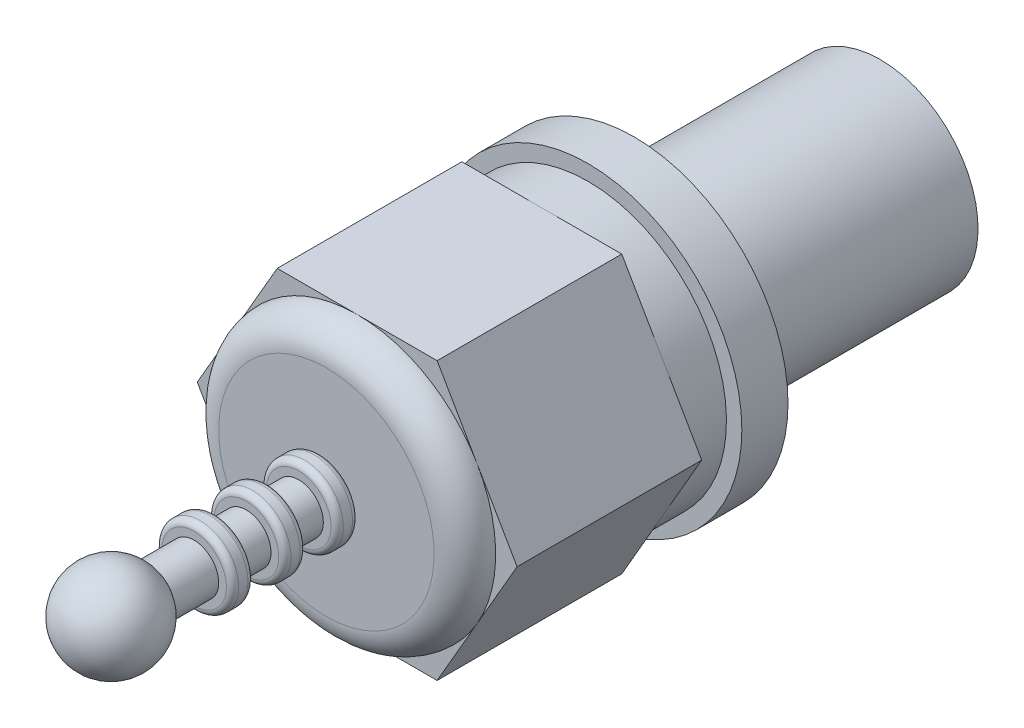
ISO-10303-21;
HEADER;
FILE_DESCRIPTION(('STEP AP214'),'2;1');
FILE_NAME('part.step','',(''),(''),'','','');
FILE_SCHEMA(('AUTOMOTIVE_DESIGN { 1 0 10303 214 1 1 1 1 }'));
ENDSEC;
DATA;
#1=APPLICATION_CONTEXT('core data for automotive mechanical design processes');
#2=APPLICATION_PROTOCOL_DEFINITION('international standard','automotive_design',2000,#1);
#3=PRODUCT_CONTEXT('',#1,'mechanical');
#4=PRODUCT('Part','Part','',(#3));
#5=PRODUCT_RELATED_PRODUCT_CATEGORY('part','',(#4));
#6=PRODUCT_DEFINITION_FORMATION('','',#4);
#7=PRODUCT_DEFINITION_CONTEXT('part definition',#1,'design');
#8=PRODUCT_DEFINITION('design','',#6,#7);
#9=PRODUCT_DEFINITION_SHAPE('','',#8);
#10=(LENGTH_UNIT() NAMED_UNIT(*) SI_UNIT(.MILLI.,.METRE.));
#11=(NAMED_UNIT(*) PLANE_ANGLE_UNIT() SI_UNIT($,.RADIAN.));
#12=(NAMED_UNIT(*) SI_UNIT($,.STERADIAN.) SOLID_ANGLE_UNIT());
#13=UNCERTAINTY_MEASURE_WITH_UNIT(LENGTH_MEASURE(1.E-05),#10,'distance_accuracy_value','');
#14=(GEOMETRIC_REPRESENTATION_CONTEXT(3) GLOBAL_UNCERTAINTY_ASSIGNED_CONTEXT((#13)) GLOBAL_UNIT_ASSIGNED_CONTEXT((#10,
#11,#12)) REPRESENTATION_CONTEXT('',''));
#15=CARTESIAN_POINT('',(0.,0.,0.));
#16=DIRECTION('',(0.,0.,1.));
#17=DIRECTION('',(1.,0.,0.));
#18=AXIS2_PLACEMENT_3D('',#15,#16,#17);
#19=CARTESIAN_POINT('',(0.,0.,0.));
#20=DIRECTION('',(0.,0.,-1.));
#21=DIRECTION('',(0.,1.,0.));
#22=AXIS2_PLACEMENT_3D('',#19,#20,#21);
#23=TOROIDAL_SURFACE('',#22,3.5,1.);
#24=CARTESIAN_POINT('',(0.,0.,1.));
#25=DIRECTION('',(0.,0.,-1.));
#26=DIRECTION('',(0.,1.,0.));
#27=AXIS2_PLACEMENT_3D('',#24,#25,#26);
#28=CIRCLE('',#27,3.5);
#29=CARTESIAN_POINT('',(0.,3.5,1.));
#30=VERTEX_POINT('',#29);
#31=EDGE_CURVE('E265',#30,#30,#28,.T.);
#32=ORIENTED_EDGE('',*,*,#31,.T.);
#33=EDGE_LOOP('',(#32));
#34=FACE_BOUND('',#33,.T.);
#35=CARTESIAN_POINT('',(0.,0.,0.));
#36=DIRECTION('',(0.,0.,-1.));
#37=DIRECTION('',(0.,1.,0.));
#38=AXIS2_PLACEMENT_3D('',#35,#36,#37);
#39=CIRCLE('',#38,4.5);
#40=CARTESIAN_POINT('',(0.,4.5,0.));
#41=VERTEX_POINT('',#40);
#42=CARTESIAN_POINT('',(3.89711431702998,2.25,0.));
#43=VERTEX_POINT('',#42);
#44=EDGE_CURVE('E268',#41,#43,#39,.T.);
#45=ORIENTED_EDGE('',*,*,#44,.F.);
#46=CARTESIAN_POINT('',(-3.89711431702998,2.25,0.));
#47=VERTEX_POINT('',#46);
#48=EDGE_CURVE('E58',#47,#41,#39,.T.);
#49=ORIENTED_EDGE('',*,*,#48,.F.);
#50=CARTESIAN_POINT('',(-3.89711431702998,-2.25000000000001,0.));
#51=VERTEX_POINT('',#50);
#52=EDGE_CURVE('E317',#51,#47,#39,.T.);
#53=ORIENTED_EDGE('',*,*,#52,.F.);
#54=CARTESIAN_POINT('',(0.,-4.50000000000001,0.));
#55=VERTEX_POINT('',#54);
#56=EDGE_CURVE('E319',#55,#51,#39,.T.);
#57=ORIENTED_EDGE('',*,*,#56,.F.);
#58=CARTESIAN_POINT('',(3.89711431702998,-2.25,0.));
#59=VERTEX_POINT('',#58);
#60=EDGE_CURVE('E320',#59,#55,#39,.T.);
#61=ORIENTED_EDGE('',*,*,#60,.F.);
#62=EDGE_CURVE('E272',#43,#59,#39,.T.);
#63=ORIENTED_EDGE('',*,*,#62,.F.);
#64=EDGE_LOOP('',(#45,#49,#53,#57,#61,#63));
#65=FACE_BOUND('',#64,.T.);
#66=ADVANCED_FACE('F34',(#34,#65),#23,.T.);
#67=CARTESIAN_POINT('',(0.,3.5,1.));
#68=DIRECTION('',(0.,0.,1.));
#69=DIRECTION('',(0.,-1.,0.));
#70=AXIS2_PLACEMENT_3D('',#67,#68,#69);
#71=PLANE('',#70);
#72=CARTESIAN_POINT('',(0.,0.,1.));
#73=DIRECTION('',(0.,0.,-1.));
#74=DIRECTION('',(0.,1.,0.));
#75=AXIS2_PLACEMENT_3D('',#72,#73,#74);
#76=CIRCLE('',#75,0.800000000000002);
#77=CARTESIAN_POINT('',(0.,0.799999999999997,1.));
#78=VERTEX_POINT('',#77);
#79=EDGE_CURVE('E262',#78,#78,#76,.T.);
#80=ORIENTED_EDGE('',*,*,#79,.T.);
#81=EDGE_LOOP('',(#80));
#82=FACE_BOUND('',#81,.T.);
#83=ORIENTED_EDGE('',*,*,#31,.F.);
#84=EDGE_LOOP('',(#83));
#85=FACE_BOUND('',#84,.T.);
#86=ADVANCED_FACE('F349',(#82,#85),#71,.T.);
#87=CARTESIAN_POINT('',(0.,0.,-17.));
#88=DIRECTION('',(0.,0.,-1.));
#89=DIRECTION('',(0.,1.,0.));
#90=AXIS2_PLACEMENT_3D('',#87,#88,#89);
#91=CYLINDRICAL_SURFACE('',#90,0.800000000000003);
#92=CARTESIAN_POINT('',(0.,0.,1.2));
#93=DIRECTION('',(0.,0.,-1.));
#94=DIRECTION('',(0.,1.,0.));
#95=AXIS2_PLACEMENT_3D('',#92,#93,#94);
#96=CIRCLE('',#95,0.800000000000004);
#97=CARTESIAN_POINT('',(0.,0.8,1.2));
#98=VERTEX_POINT('',#97);
#99=EDGE_CURVE('E259',#98,#98,#96,.T.);
#100=ORIENTED_EDGE('',*,*,#99,.T.);
#101=EDGE_LOOP('',(#100));
#102=FACE_BOUND('',#101,.T.);
#103=ORIENTED_EDGE('',*,*,#79,.F.);
#104=EDGE_LOOP('',(#103));
#105=FACE_BOUND('',#104,.T.);
#106=ADVANCED_FACE('F355',(#102,#105),#91,.T.);
#107=CARTESIAN_POINT('',(0.,0.8,1.2));
#108=DIRECTION('',(0.,0.,-1.));
#109=DIRECTION('',(0.,1.,0.));
#110=AXIS2_PLACEMENT_3D('',#107,#108,#109);
#111=PLANE('',#110);
#112=CARTESIAN_POINT('',(0.,0.,1.2));
#113=DIRECTION('',(0.,0.,-1.));
#114=DIRECTION('',(0.,1.,0.));
#115=AXIS2_PLACEMENT_3D('',#112,#113,#114);
#116=CIRCLE('',#115,1.05000000000001);
#117=CARTESIAN_POINT('',(0.,1.05,1.2));
#118=VERTEX_POINT('',#117);
#119=EDGE_CURVE('E256',#118,#118,#116,.T.);
#120=ORIENTED_EDGE('',*,*,#119,.T.);
#121=EDGE_LOOP('',(#120));
#122=FACE_BOUND('',#121,.T.);
#123=ORIENTED_EDGE('',*,*,#99,.F.);
#124=EDGE_LOOP('',(#123));
#125=FACE_BOUND('',#124,.T.);
#126=ADVANCED_FACE('F615',(#122,#125),#111,.T.);
#127=CARTESIAN_POINT('',(0.,0.,1.4));
#128=DIRECTION('',(0.,0.,-1.));
#129=DIRECTION('',(0.,1.,0.));
#130=AXIS2_PLACEMENT_3D('',#127,#128,#129);
#131=TOROIDAL_SURFACE('',#130,1.05000000000001,0.2);
#132=CARTESIAN_POINT('',(0.,0.,1.4));
#133=DIRECTION('',(0.,0.,-1.));
#134=DIRECTION('',(0.,1.,0.));
#135=AXIS2_PLACEMENT_3D('',#132,#133,#134);
#136=CIRCLE('',#135,1.25000000000001);
#137=CARTESIAN_POINT('',(0.,1.25,1.4));
#138=VERTEX_POINT('',#137);
#139=EDGE_CURVE('E253',#138,#138,#136,.T.);
#140=ORIENTED_EDGE('',*,*,#139,.T.);
#141=EDGE_LOOP('',(#140));
#142=FACE_BOUND('',#141,.T.);
#143=ORIENTED_EDGE('',*,*,#119,.F.);
#144=EDGE_LOOP('',(#143));
#145=FACE_BOUND('',#144,.T.);
#146=ADVANCED_FACE('F607',(#142,#145),#131,.T.);
#147=CARTESIAN_POINT('',(0.,0.,-17.));
#148=DIRECTION('',(0.,0.,-1.));
#149=DIRECTION('',(0.,1.,0.));
#150=AXIS2_PLACEMENT_3D('',#147,#148,#149);
#151=CYLINDRICAL_SURFACE('',#150,1.25000000000001);
#152=CARTESIAN_POINT('',(0.,0.,1.7));
#153=DIRECTION('',(0.,0.,-1.));
#154=DIRECTION('',(0.,1.,0.));
#155=AXIS2_PLACEMENT_3D('',#152,#153,#154);
#156=CIRCLE('',#155,1.25000000000001);
#157=CARTESIAN_POINT('',(0.,1.25,1.7));
#158=VERTEX_POINT('',#157);
#159=EDGE_CURVE('E250',#158,#158,#156,.T.);
#160=ORIENTED_EDGE('',*,*,#159,.T.);
#161=EDGE_LOOP('',(#160));
#162=FACE_BOUND('',#161,.T.);
#163=ORIENTED_EDGE('',*,*,#139,.F.);
#164=EDGE_LOOP('',(#163));
#165=FACE_BOUND('',#164,.T.);
#166=ADVANCED_FACE('F599',(#162,#165),#151,.T.);
#167=CARTESIAN_POINT('',(0.,0.,1.7));
#168=DIRECTION('',(0.,0.,-1.));
#169=DIRECTION('',(0.,1.,0.));
#170=AXIS2_PLACEMENT_3D('',#167,#168,#169);
#171=TOROIDAL_SURFACE('',#170,1.05000000000001,0.2);
#172=CARTESIAN_POINT('',(0.,0.,1.9));
#173=DIRECTION('',(0.,0.,-1.));
#174=DIRECTION('',(0.,1.,0.));
#175=AXIS2_PLACEMENT_3D('',#172,#173,#174);
#176=CIRCLE('',#175,1.05000000000001);
#177=CARTESIAN_POINT('',(0.,1.05,1.9));
#178=VERTEX_POINT('',#177);
#179=EDGE_CURVE('E247',#178,#178,#176,.T.);
#180=ORIENTED_EDGE('',*,*,#179,.T.);
#181=EDGE_LOOP('',(#180));
#182=FACE_BOUND('',#181,.T.);
#183=ORIENTED_EDGE('',*,*,#159,.F.);
#184=EDGE_LOOP('',(#183));
#185=FACE_BOUND('',#184,.T.);
#186=ADVANCED_FACE('F592',(#182,#185),#171,.T.);
#187=CARTESIAN_POINT('',(0.,0.799999999999999,1.9));
#188=DIRECTION('',(0.,0.,1.));
#189=DIRECTION('',(0.,-1.,0.));
#190=AXIS2_PLACEMENT_3D('',#187,#188,#189);
#191=PLANE('',#190);
#192=CARTESIAN_POINT('',(0.,0.,1.9));
#193=DIRECTION('',(0.,0.,-1.));
#194=DIRECTION('',(0.,1.,0.));
#195=AXIS2_PLACEMENT_3D('',#192,#193,#194);
#196=CIRCLE('',#195,0.800000000000004);
#197=CARTESIAN_POINT('',(0.,0.799999999999999,1.9));
#198=VERTEX_POINT('',#197);
#199=EDGE_CURVE('E244',#198,#198,#196,.T.);
#200=ORIENTED_EDGE('',*,*,#199,.T.);
#201=EDGE_LOOP('',(#200));
#202=FACE_BOUND('',#201,.T.);
#203=ORIENTED_EDGE('',*,*,#179,.F.);
#204=EDGE_LOOP('',(#203));
#205=FACE_BOUND('',#204,.T.);
#206=ADVANCED_FACE('F584',(#202,#205),#191,.T.);
#207=CARTESIAN_POINT('',(0.,0.,-17.));
#208=DIRECTION('',(0.,0.,-1.));
#209=DIRECTION('',(0.,1.,0.));
#210=AXIS2_PLACEMENT_3D('',#207,#208,#209);
#211=CYLINDRICAL_SURFACE('',#210,0.800000000000004);
#212=CARTESIAN_POINT('',(0.,0.,2.9));
#213=DIRECTION('',(0.,0.,-1.));
#214=DIRECTION('',(0.,1.,0.));
#215=AXIS2_PLACEMENT_3D('',#212,#213,#214);
#216=CIRCLE('',#215,0.800000000000004);
#217=CARTESIAN_POINT('',(0.,0.8,2.9));
#218=VERTEX_POINT('',#217);
#219=EDGE_CURVE('E241',#218,#218,#216,.T.);
#220=ORIENTED_EDGE('',*,*,#219,.T.);
#221=EDGE_LOOP('',(#220));
#222=FACE_BOUND('',#221,.T.);
#223=ORIENTED_EDGE('',*,*,#199,.F.);
#224=EDGE_LOOP('',(#223));
#225=FACE_BOUND('',#224,.T.);
#226=ADVANCED_FACE('F577',(#222,#225),#211,.T.);
#227=CARTESIAN_POINT('',(0.,0.8,2.9));
#228=DIRECTION('',(0.,0.,-1.));
#229=DIRECTION('',(0.,1.,0.));
#230=AXIS2_PLACEMENT_3D('',#227,#228,#229);
#231=PLANE('',#230);
#232=CARTESIAN_POINT('',(0.,0.,2.9));
#233=DIRECTION('',(0.,0.,-1.));
#234=DIRECTION('',(0.,1.,0.));
#235=AXIS2_PLACEMENT_3D('',#232,#233,#234);
#236=CIRCLE('',#235,1.05000000000001);
#237=CARTESIAN_POINT('',(0.,1.05,2.9));
#238=VERTEX_POINT('',#237);
#239=EDGE_CURVE('E238',#238,#238,#236,.T.);
#240=ORIENTED_EDGE('',*,*,#239,.T.);
#241=EDGE_LOOP('',(#240));
#242=FACE_BOUND('',#241,.T.);
#243=ORIENTED_EDGE('',*,*,#219,.F.);
#244=EDGE_LOOP('',(#243));
#245=FACE_BOUND('',#244,.T.);
#246=ADVANCED_FACE('F568',(#242,#245),#231,.T.);
#247=CARTESIAN_POINT('',(0.,0.,3.1));
#248=DIRECTION('',(0.,0.,-1.));
#249=DIRECTION('',(0.,1.,0.));
#250=AXIS2_PLACEMENT_3D('',#247,#248,#249);
#251=TOROIDAL_SURFACE('',#250,1.05000000000001,0.2);
#252=CARTESIAN_POINT('',(0.,0.,3.1));
#253=DIRECTION('',(0.,0.,-1.));
#254=DIRECTION('',(0.,1.,0.));
#255=AXIS2_PLACEMENT_3D('',#252,#253,#254);
#256=CIRCLE('',#255,1.25000000000001);
#257=CARTESIAN_POINT('',(0.,1.25,3.1));
#258=VERTEX_POINT('',#257);
#259=EDGE_CURVE('E235',#258,#258,#256,.T.);
#260=ORIENTED_EDGE('',*,*,#259,.T.);
#261=EDGE_LOOP('',(#260));
#262=FACE_BOUND('',#261,.T.);
#263=ORIENTED_EDGE('',*,*,#239,.F.);
#264=EDGE_LOOP('',(#263));
#265=FACE_BOUND('',#264,.T.);
#266=ADVANCED_FACE('F560',(#262,#265),#251,.T.);
#267=CARTESIAN_POINT('',(0.,0.,-17.));
#268=DIRECTION('',(0.,0.,-1.));
#269=DIRECTION('',(0.,1.,0.));
#270=AXIS2_PLACEMENT_3D('',#267,#268,#269);
#271=CYLINDRICAL_SURFACE('',#270,1.25000000000001);
#272=CARTESIAN_POINT('',(0.,0.,3.4));
#273=DIRECTION('',(0.,0.,-1.));
#274=DIRECTION('',(0.,1.,0.));
#275=AXIS2_PLACEMENT_3D('',#272,#273,#274);
#276=CIRCLE('',#275,1.25000000000001);
#277=CARTESIAN_POINT('',(0.,1.25,3.4));
#278=VERTEX_POINT('',#277);
#279=EDGE_CURVE('E232',#278,#278,#276,.T.);
#280=ORIENTED_EDGE('',*,*,#279,.T.);
#281=EDGE_LOOP('',(#280));
#282=FACE_BOUND('',#281,.T.);
#283=ORIENTED_EDGE('',*,*,#259,.F.);
#284=EDGE_LOOP('',(#283));
#285=FACE_BOUND('',#284,.T.);
#286=ADVANCED_FACE('F552',(#282,#285),#271,.T.);
#287=CARTESIAN_POINT('',(0.,0.,3.4));
#288=DIRECTION('',(0.,0.,-1.));
#289=DIRECTION('',(0.,1.,0.));
#290=AXIS2_PLACEMENT_3D('',#287,#288,#289);
#291=TOROIDAL_SURFACE('',#290,1.05000000000001,0.2);
#292=CARTESIAN_POINT('',(0.,0.,3.6));
#293=DIRECTION('',(0.,0.,-1.));
#294=DIRECTION('',(0.,1.,0.));
#295=AXIS2_PLACEMENT_3D('',#292,#293,#294);
#296=CIRCLE('',#295,1.05000000000001);
#297=CARTESIAN_POINT('',(0.,1.05,3.6));
#298=VERTEX_POINT('',#297);
#299=EDGE_CURVE('E229',#298,#298,#296,.T.);
#300=ORIENTED_EDGE('',*,*,#299,.T.);
#301=EDGE_LOOP('',(#300));
#302=FACE_BOUND('',#301,.T.);
#303=ORIENTED_EDGE('',*,*,#279,.F.);
#304=EDGE_LOOP('',(#303));
#305=FACE_BOUND('',#304,.T.);
#306=ADVANCED_FACE('F544',(#302,#305),#291,.T.);
#307=CARTESIAN_POINT('',(0.,0.799999999999999,3.6));
#308=DIRECTION('',(0.,0.,1.));
#309=DIRECTION('',(0.,-1.,0.));
#310=AXIS2_PLACEMENT_3D('',#307,#308,#309);
#311=PLANE('',#310);
#312=CARTESIAN_POINT('',(0.,0.,3.6));
#313=DIRECTION('',(0.,0.,-1.));
#314=DIRECTION('',(0.,1.,0.));
#315=AXIS2_PLACEMENT_3D('',#312,#313,#314);
#316=CIRCLE('',#315,0.800000000000004);
#317=CARTESIAN_POINT('',(0.,0.799999999999999,3.6));
#318=VERTEX_POINT('',#317);
#319=EDGE_CURVE('E226',#318,#318,#316,.T.);
#320=ORIENTED_EDGE('',*,*,#319,.T.);
#321=EDGE_LOOP('',(#320));
#322=FACE_BOUND('',#321,.T.);
#323=ORIENTED_EDGE('',*,*,#299,.F.);
#324=EDGE_LOOP('',(#323));
#325=FACE_BOUND('',#324,.T.);
#326=ADVANCED_FACE('F536',(#322,#325),#311,.T.);
#327=CARTESIAN_POINT('',(0.,0.,-17.));
#328=DIRECTION('',(0.,0.,-1.));
#329=DIRECTION('',(0.,1.,0.));
#330=AXIS2_PLACEMENT_3D('',#327,#328,#329);
#331=CYLINDRICAL_SURFACE('',#330,0.800000000000004);
#332=CARTESIAN_POINT('',(0.,0.,4.6));
#333=DIRECTION('',(0.,0.,-1.));
#334=DIRECTION('',(0.,1.,0.));
#335=AXIS2_PLACEMENT_3D('',#332,#333,#334);
#336=CIRCLE('',#335,0.800000000000004);
#337=CARTESIAN_POINT('',(0.,0.799999999999999,4.6));
#338=VERTEX_POINT('',#337);
#339=EDGE_CURVE('E223',#338,#338,#336,.T.);
#340=ORIENTED_EDGE('',*,*,#339,.T.);
#341=EDGE_LOOP('',(#340));
#342=FACE_BOUND('',#341,.T.);
#343=ORIENTED_EDGE('',*,*,#319,.F.);
#344=EDGE_LOOP('',(#343));
#345=FACE_BOUND('',#344,.T.);
#346=ADVANCED_FACE('F528',(#342,#345),#331,.T.);
#347=CARTESIAN_POINT('',(0.,0.799999999999999,4.6));
#348=DIRECTION('',(0.,0.,-1.));
#349=DIRECTION('',(0.,1.,0.));
#350=AXIS2_PLACEMENT_3D('',#347,#348,#349);
#351=PLANE('',#350);
#352=CARTESIAN_POINT('',(0.,0.,4.6));
#353=DIRECTION('',(0.,0.,-1.));
#354=DIRECTION('',(0.,1.,0.));
#355=AXIS2_PLACEMENT_3D('',#352,#353,#354);
#356=CIRCLE('',#355,1.05000000000001);
#357=CARTESIAN_POINT('',(0.,1.05,4.6));
#358=VERTEX_POINT('',#357);
#359=EDGE_CURVE('E220',#358,#358,#356,.T.);
#360=ORIENTED_EDGE('',*,*,#359,.T.);
#361=EDGE_LOOP('',(#360));
#362=FACE_BOUND('',#361,.T.);
#363=ORIENTED_EDGE('',*,*,#339,.F.);
#364=EDGE_LOOP('',(#363));
#365=FACE_BOUND('',#364,.T.);
#366=ADVANCED_FACE('F520',(#362,#365),#351,.T.);
#367=CARTESIAN_POINT('',(0.,0.,4.8));
#368=DIRECTION('',(0.,0.,-1.));
#369=DIRECTION('',(0.,1.,0.));
#370=AXIS2_PLACEMENT_3D('',#367,#368,#369);
#371=TOROIDAL_SURFACE('',#370,1.05000000000001,0.2);
#372=CARTESIAN_POINT('',(0.,0.,4.8));
#373=DIRECTION('',(0.,0.,-1.));
#374=DIRECTION('',(0.,1.,0.));
#375=AXIS2_PLACEMENT_3D('',#372,#373,#374);
#376=CIRCLE('',#375,1.25000000000001);
#377=CARTESIAN_POINT('',(0.,1.25,4.8));
#378=VERTEX_POINT('',#377);
#379=EDGE_CURVE('E217',#378,#378,#376,.T.);
#380=ORIENTED_EDGE('',*,*,#379,.T.);
#381=EDGE_LOOP('',(#380));
#382=FACE_BOUND('',#381,.T.);
#383=ORIENTED_EDGE('',*,*,#359,.F.);
#384=EDGE_LOOP('',(#383));
#385=FACE_BOUND('',#384,.T.);
#386=ADVANCED_FACE('F512',(#382,#385),#371,.T.);
#387=CARTESIAN_POINT('',(0.,0.,-17.));
#388=DIRECTION('',(0.,0.,-1.));
#389=DIRECTION('',(0.,1.,0.));
#390=AXIS2_PLACEMENT_3D('',#387,#388,#389);
#391=CYLINDRICAL_SURFACE('',#390,1.25000000000001);
#392=CARTESIAN_POINT('',(0.,0.,5.1));
#393=DIRECTION('',(0.,0.,-1.));
#394=DIRECTION('',(0.,1.,0.));
#395=AXIS2_PLACEMENT_3D('',#392,#393,#394);
#396=CIRCLE('',#395,1.25000000000001);
#397=CARTESIAN_POINT('',(0.,1.25,5.1));
#398=VERTEX_POINT('',#397);
#399=EDGE_CURVE('E214',#398,#398,#396,.T.);
#400=ORIENTED_EDGE('',*,*,#399,.T.);
#401=EDGE_LOOP('',(#400));
#402=FACE_BOUND('',#401,.T.);
#403=ORIENTED_EDGE('',*,*,#379,.F.);
#404=EDGE_LOOP('',(#403));
#405=FACE_BOUND('',#404,.T.);
#406=ADVANCED_FACE('F504',(#402,#405),#391,.T.);
#407=CARTESIAN_POINT('',(0.,0.,5.1));
#408=DIRECTION('',(0.,0.,-1.));
#409=DIRECTION('',(0.,1.,0.));
#410=AXIS2_PLACEMENT_3D('',#407,#408,#409);
#411=TOROIDAL_SURFACE('',#410,1.05000000000001,0.200000000000001);
#412=CARTESIAN_POINT('',(0.,0.,5.3));
#413=DIRECTION('',(0.,0.,-1.));
#414=DIRECTION('',(0.,1.,0.));
#415=AXIS2_PLACEMENT_3D('',#412,#413,#414);
#416=CIRCLE('',#415,1.05000000000001);
#417=CARTESIAN_POINT('',(0.,1.05,5.3));
#418=VERTEX_POINT('',#417);
#419=EDGE_CURVE('E211',#418,#418,#416,.T.);
#420=ORIENTED_EDGE('',*,*,#419,.T.);
#421=EDGE_LOOP('',(#420));
#422=FACE_BOUND('',#421,.T.);
#423=ORIENTED_EDGE('',*,*,#399,.F.);
#424=EDGE_LOOP('',(#423));
#425=FACE_BOUND('',#424,.T.);
#426=ADVANCED_FACE('F494',(#422,#425),#411,.T.);
#427=CARTESIAN_POINT('',(0.,0.8,5.3));
#428=DIRECTION('',(0.,0.,1.));
#429=DIRECTION('',(0.,-1.,0.));
#430=AXIS2_PLACEMENT_3D('',#427,#428,#429);
#431=PLANE('',#430);
#432=CARTESIAN_POINT('',(0.,0.,5.3));
#433=DIRECTION('',(0.,0.,-1.));
#434=DIRECTION('',(0.,1.,0.));
#435=AXIS2_PLACEMENT_3D('',#432,#433,#434);
#436=CIRCLE('',#435,0.800000000000004);
#437=CARTESIAN_POINT('',(0.,0.799999999999999,5.3));
#438=VERTEX_POINT('',#437);
#439=EDGE_CURVE('E208',#438,#438,#436,.T.);
#440=ORIENTED_EDGE('',*,*,#439,.T.);
#441=EDGE_LOOP('',(#440));
#442=FACE_BOUND('',#441,.T.);
#443=ORIENTED_EDGE('',*,*,#419,.F.);
#444=EDGE_LOOP('',(#443));
#445=FACE_BOUND('',#444,.T.);
#446=ADVANCED_FACE('F485',(#442,#445),#431,.T.);
#447=CARTESIAN_POINT('',(0.,0.,-17.));
#448=DIRECTION('',(0.,0.,-1.));
#449=DIRECTION('',(0.,1.,0.));
#450=AXIS2_PLACEMENT_3D('',#447,#448,#449);
#451=CYLINDRICAL_SURFACE('',#450,0.800000000000002);
#452=CARTESIAN_POINT('',(0.,0.,6.73114224595505));
#453=DIRECTION('',(0.,0.,-1.));
#454=DIRECTION('',(0.,1.,0.));
#455=AXIS2_PLACEMENT_3D('',#452,#453,#454);
#456=CIRCLE('',#455,0.800000000000001);
#457=CARTESIAN_POINT('',(0.,0.799999999999996,6.73114224595505));
#458=VERTEX_POINT('',#457);
#459=EDGE_CURVE('E194',#458,#458,#456,.T.);
#460=ORIENTED_EDGE('',*,*,#459,.T.);
#461=EDGE_LOOP('',(#460));
#462=FACE_BOUND('',#461,.T.);
#463=ORIENTED_EDGE('',*,*,#439,.F.);
#464=EDGE_LOOP('',(#463));
#465=FACE_BOUND('',#464,.T.);
#466=ADVANCED_FACE('F476',(#462,#465),#451,.T.);
#467=CARTESIAN_POINT('',(0.,0.,8.));
#468=DIRECTION('',(0.,0.,-1.));
#469=DIRECTION('',(0.,1.,0.));
#470=AXIS2_PLACEMENT_3D('',#467,#468,#469);
#471=SPHERICAL_SURFACE('',#470,1.5);
#472=ORIENTED_EDGE('',*,*,#459,.F.);
#473=EDGE_LOOP('',(#472));
#474=FACE_BOUND('',#473,.T.);
#475=ADVANCED_FACE('F469',(#474),#471,.T.);
#476=CARTESIAN_POINT('',(2.59807621135332,4.5,-6.));
#477=DIRECTION('',(0.,1.,0.));
#478=DIRECTION('',(-1.,0.,0.));
#479=AXIS2_PLACEMENT_3D('',#476,#477,#478);
#480=PLANE('',#479);
#481=DIRECTION('',(-1.,0.,0.));
#482=VECTOR('',#481,1.);
#483=CARTESIAN_POINT('',(2.59807621135332,4.5,0.));
#484=LINE('',#483,#482);
#485=CARTESIAN_POINT('',(-2.59807621135332,4.5,0.));
#486=VERTEX_POINT('',#485);
#487=EDGE_CURVE('E174',#41,#486,#484,.T.);
#488=ORIENTED_EDGE('',*,*,#487,.F.);
#489=CARTESIAN_POINT('',(2.59807621135332,4.5,0.));
#490=VERTEX_POINT('',#489);
#491=EDGE_CURVE('E170',#490,#41,#484,.T.);
#492=ORIENTED_EDGE('',*,*,#491,.F.);
#493=DIRECTION('',(0.,0.,1.));
#494=VECTOR('',#493,1.);
#495=CARTESIAN_POINT('',(2.59807621135332,4.5,-6.));
#496=LINE('',#495,#494);
#497=CARTESIAN_POINT('',(2.59807621135332,4.5,-6.));
#498=VERTEX_POINT('',#497);
#499=EDGE_CURVE('E191',#498,#490,#496,.T.);
#500=ORIENTED_EDGE('',*,*,#499,.F.);
#501=DIRECTION('',(-1.,0.,0.));
#502=VECTOR('',#501,1.);
#503=CARTESIAN_POINT('',(2.59807621135332,4.5,-6.));
#504=LINE('',#503,#502);
#505=CARTESIAN_POINT('',(0.,4.5,-6.));
#506=VERTEX_POINT('',#505);
#507=EDGE_CURVE('E134',#498,#506,#504,.T.);
#508=ORIENTED_EDGE('',*,*,#507,.T.);
#509=CARTESIAN_POINT('',(-2.59807621135332,4.5,-6.));
#510=VERTEX_POINT('',#509);
#511=EDGE_CURVE('E126',#506,#510,#504,.T.);
#512=ORIENTED_EDGE('',*,*,#511,.T.);
#513=DIRECTION('',(0.,0.,1.));
#514=VECTOR('',#513,1.);
#515=CARTESIAN_POINT('',(-2.59807621135332,4.5,-6.));
#516=LINE('',#515,#514);
#517=EDGE_CURVE('E130',#510,#486,#516,.T.);
#518=ORIENTED_EDGE('',*,*,#517,.T.);
#519=EDGE_LOOP('',(#488,#492,#500,#508,#512,#518));
#520=FACE_BOUND('',#519,.T.);
#521=ADVANCED_FACE('F129',(#520),#480,.T.);
#522=CARTESIAN_POINT('',(5.19615242270664,0.,-6.));
#523=DIRECTION('',(0.866025403784438,0.5,0.));
#524=DIRECTION('',(-0.5,0.866025403784439,0.));
#525=AXIS2_PLACEMENT_3D('',#522,#523,#524);
#526=PLANE('',#525);
#527=DIRECTION('',(-0.5,0.866025403784439,0.));
#528=VECTOR('',#527,1.);
#529=CARTESIAN_POINT('',(5.19615242270664,0.,0.));
#530=LINE('',#529,#528);
#531=EDGE_CURVE('E188',#43,#490,#530,.T.);
#532=ORIENTED_EDGE('',*,*,#531,.F.);
#533=CARTESIAN_POINT('',(5.19615242270664,0.,0.));
#534=VERTEX_POINT('',#533);
#535=EDGE_CURVE('E138',#534,#43,#530,.T.);
#536=ORIENTED_EDGE('',*,*,#535,.F.);
#537=DIRECTION('',(0.,0.,1.));
#538=VECTOR('',#537,1.);
#539=CARTESIAN_POINT('',(5.19615242270664,0.,-6.));
#540=LINE('',#539,#538);
#541=CARTESIAN_POINT('',(5.19615242270664,0.,-6.));
#542=VERTEX_POINT('',#541);
#543=EDGE_CURVE('E195',#542,#534,#540,.T.);
#544=ORIENTED_EDGE('',*,*,#543,.F.);
#545=DIRECTION('',(-0.5,0.866025403784439,0.));
#546=VECTOR('',#545,1.);
#547=CARTESIAN_POINT('',(5.19615242270664,0.,-6.));
#548=LINE('',#547,#546);
#549=CARTESIAN_POINT('',(3.89711431702998,2.25,-6.));
#550=VERTEX_POINT('',#549);
#551=EDGE_CURVE('E149',#542,#550,#548,.T.);
#552=ORIENTED_EDGE('',*,*,#551,.T.);
#553=EDGE_CURVE('E167',#550,#498,#548,.T.);
#554=ORIENTED_EDGE('',*,*,#553,.T.);
#555=ORIENTED_EDGE('',*,*,#499,.T.);
#556=EDGE_LOOP('',(#532,#536,#544,#552,#554,#555));
#557=FACE_BOUND('',#556,.T.);
#558=ADVANCED_FACE('F329',(#557),#526,.T.);
#559=CARTESIAN_POINT('',(2.59807621135332,-4.5,-6.));
#560=DIRECTION('',(0.866025403784439,-0.5,0.));
#561=DIRECTION('',(0.5,0.866025403784439,0.));
#562=AXIS2_PLACEMENT_3D('',#559,#560,#561);
#563=PLANE('',#562);
#564=DIRECTION('',(0.5,0.866025403784439,0.));
#565=VECTOR('',#564,1.);
#566=CARTESIAN_POINT('',(2.59807621135332,-4.5,0.));
#567=LINE('',#566,#565);
#568=EDGE_CURVE('E184',#59,#534,#567,.T.);
#569=ORIENTED_EDGE('',*,*,#568,.F.);
#570=CARTESIAN_POINT('',(2.59807621135332,-4.5,0.));
#571=VERTEX_POINT('',#570);
#572=EDGE_CURVE('E185',#571,#59,#567,.T.);
#573=ORIENTED_EDGE('',*,*,#572,.F.);
#574=DIRECTION('',(0.,0.,1.));
#575=VECTOR('',#574,1.);
#576=CARTESIAN_POINT('',(2.59807621135332,-4.5,-6.));
#577=LINE('',#576,#575);
#578=CARTESIAN_POINT('',(2.59807621135332,-4.5,-6.));
#579=VERTEX_POINT('',#578);
#580=EDGE_CURVE('E198',#579,#571,#577,.T.);
#581=ORIENTED_EDGE('',*,*,#580,.F.);
#582=DIRECTION('',(0.5,0.866025403784439,0.));
#583=VECTOR('',#582,1.);
#584=CARTESIAN_POINT('',(2.59807621135332,-4.5,-6.));
#585=LINE('',#584,#583);
#586=CARTESIAN_POINT('',(3.89711431702998,-2.25,-6.));
#587=VERTEX_POINT('',#586);
#588=EDGE_CURVE('E50',#579,#587,#585,.T.);
#589=ORIENTED_EDGE('',*,*,#588,.T.);
#590=EDGE_CURVE('E165',#587,#542,#585,.T.);
#591=ORIENTED_EDGE('',*,*,#590,.T.);
#592=ORIENTED_EDGE('',*,*,#543,.T.);
#593=EDGE_LOOP('',(#569,#573,#581,#589,#591,#592));
#594=FACE_BOUND('',#593,.T.);
#595=ADVANCED_FACE('F338',(#594),#563,.T.);
#596=CARTESIAN_POINT('',(-2.59807621135331,-4.5,-6.));
#597=DIRECTION('',(0.,-1.,0.));
#598=DIRECTION('',(1.,0.,0.));
#599=AXIS2_PLACEMENT_3D('',#596,#597,#598);
#600=PLANE('',#599);
#601=DIRECTION('',(1.,0.,0.));
#602=VECTOR('',#601,1.);
#603=CARTESIAN_POINT('',(-2.59807621135331,-4.5,0.));
#604=LINE('',#603,#602);
#605=EDGE_CURVE('E180',#55,#571,#604,.T.);
#606=ORIENTED_EDGE('',*,*,#605,.F.);
#607=CARTESIAN_POINT('',(-2.59807621135331,-4.5,0.));
#608=VERTEX_POINT('',#607);
#609=EDGE_CURVE('E181',#608,#55,#604,.T.);
#610=ORIENTED_EDGE('',*,*,#609,.F.);
#611=DIRECTION('',(0.,0.,1.));
#612=VECTOR('',#611,1.);
#613=CARTESIAN_POINT('',(-2.59807621135331,-4.5,-6.));
#614=LINE('',#613,#612);
#615=CARTESIAN_POINT('',(-2.59807621135331,-4.5,-6.));
#616=VERTEX_POINT('',#615);
#617=EDGE_CURVE('E201',#616,#608,#614,.T.);
#618=ORIENTED_EDGE('',*,*,#617,.F.);
#619=DIRECTION('',(1.,0.,0.));
#620=VECTOR('',#619,1.);
#621=CARTESIAN_POINT('',(-2.59807621135331,-4.5,-6.));
#622=LINE('',#621,#620);
#623=CARTESIAN_POINT('',(0.,-4.5,-6.));
#624=VERTEX_POINT('',#623);
#625=EDGE_CURVE('E162',#616,#624,#622,.T.);
#626=ORIENTED_EDGE('',*,*,#625,.T.);
#627=EDGE_CURVE('E161',#624,#579,#622,.T.);
#628=ORIENTED_EDGE('',*,*,#627,.T.);
#629=ORIENTED_EDGE('',*,*,#580,.T.);
#630=EDGE_LOOP('',(#606,#610,#618,#626,#628,#629));
#631=FACE_BOUND('',#630,.T.);
#632=ADVANCED_FACE('F305',(#631),#600,.T.);
#633=CARTESIAN_POINT('',(-5.19615242270663,0.,-6.));
#634=DIRECTION('',(-0.866025403784439,-0.5,0.));
#635=DIRECTION('',(0.5,-0.866025403784439,0.));
#636=AXIS2_PLACEMENT_3D('',#633,#634,#635);
#637=PLANE('',#636);
#638=DIRECTION('',(0.5,-0.866025403784438,0.));
#639=VECTOR('',#638,1.);
#640=CARTESIAN_POINT('',(-5.19615242270663,0.,0.));
#641=LINE('',#640,#639);
#642=EDGE_CURVE('E176',#51,#608,#641,.T.);
#643=ORIENTED_EDGE('',*,*,#642,.F.);
#644=CARTESIAN_POINT('',(-5.19615242270663,0.,0.));
#645=VERTEX_POINT('',#644);
#646=EDGE_CURVE('E177',#645,#51,#641,.T.);
#647=ORIENTED_EDGE('',*,*,#646,.F.);
#648=DIRECTION('',(0.,0.,1.));
#649=VECTOR('',#648,1.);
#650=CARTESIAN_POINT('',(-5.19615242270663,0.,-6.));
#651=LINE('',#650,#649);
#652=CARTESIAN_POINT('',(-5.19615242270663,0.,-6.));
#653=VERTEX_POINT('',#652);
#654=EDGE_CURVE('E148',#653,#645,#651,.T.);
#655=ORIENTED_EDGE('',*,*,#654,.F.);
#656=DIRECTION('',(0.5,-0.866025403784438,0.));
#657=VECTOR('',#656,1.);
#658=CARTESIAN_POINT('',(-5.19615242270663,0.,-6.));
#659=LINE('',#658,#657);
#660=CARTESIAN_POINT('',(-3.89711431702997,-2.25,-6.));
#661=VERTEX_POINT('',#660);
#662=EDGE_CURVE('E157',#653,#661,#659,.T.);
#663=ORIENTED_EDGE('',*,*,#662,.T.);
#664=EDGE_CURVE('E154',#661,#616,#659,.T.);
#665=ORIENTED_EDGE('',*,*,#664,.T.);
#666=ORIENTED_EDGE('',*,*,#617,.T.);
#667=EDGE_LOOP('',(#643,#647,#655,#663,#665,#666));
#668=FACE_BOUND('',#667,.T.);
#669=ADVANCED_FACE('F309',(#668),#637,.T.);
#670=CARTESIAN_POINT('',(-2.59807621135332,4.5,-6.));
#671=DIRECTION('',(-0.866025403784439,0.5,0.));
#672=DIRECTION('',(-0.5,-0.866025403784439,0.));
#673=AXIS2_PLACEMENT_3D('',#670,#671,#672);
#674=PLANE('',#673);
#675=DIRECTION('',(-0.5,-0.866025403784439,0.));
#676=VECTOR('',#675,1.);
#677=CARTESIAN_POINT('',(-2.59807621135332,4.5,0.));
#678=LINE('',#677,#676);
#679=EDGE_CURVE('E173',#47,#645,#678,.T.);
#680=ORIENTED_EDGE('',*,*,#679,.F.);
#681=EDGE_CURVE('E147',#486,#47,#678,.T.);
#682=ORIENTED_EDGE('',*,*,#681,.F.);
#683=ORIENTED_EDGE('',*,*,#517,.F.);
#684=DIRECTION('',(-0.5,-0.866025403784439,0.));
#685=VECTOR('',#684,1.);
#686=CARTESIAN_POINT('',(-2.59807621135332,4.5,-6.));
#687=LINE('',#686,#685);
#688=CARTESIAN_POINT('',(-3.89711431702998,2.25,-6.));
#689=VERTEX_POINT('',#688);
#690=EDGE_CURVE('E144',#510,#689,#687,.T.);
#691=ORIENTED_EDGE('',*,*,#690,.T.);
#692=EDGE_CURVE('E155',#689,#653,#687,.T.);
#693=ORIENTED_EDGE('',*,*,#692,.T.);
#694=ORIENTED_EDGE('',*,*,#654,.T.);
#695=EDGE_LOOP('',(#680,#682,#683,#691,#693,#694));
#696=FACE_BOUND('',#695,.T.);
#697=ADVANCED_FACE('F143',(#696),#674,.T.);
#698=CARTESIAN_POINT('',(-2.59807621135332,4.5,-6.));
#699=DIRECTION('',(0.,0.,1.));
#700=DIRECTION('',(1.,0.,0.));
#701=AXIS2_PLACEMENT_3D('',#698,#699,#700);
#702=PLANE('',#701);
#703=CARTESIAN_POINT('',(0.,0.,-6.));
#704=DIRECTION('',(0.,0.,1.));
#705=DIRECTION('',(1.,0.,0.));
#706=AXIS2_PLACEMENT_3D('',#703,#704,#705);
#707=CIRCLE('',#706,4.5);
#708=EDGE_CURVE('E11',#587,#624,#707,.F.);
#709=ORIENTED_EDGE('',*,*,#708,.F.);
#710=ORIENTED_EDGE('',*,*,#588,.F.);
#711=ORIENTED_EDGE('',*,*,#627,.F.);
#712=EDGE_LOOP('',(#709,#710,#711));
#713=FACE_BOUND('',#712,.T.);
#714=ADVANCED_FACE('F301',(#713),#702,.F.);
#715=EDGE_CURVE('E43',#624,#661,#707,.F.);
#716=ORIENTED_EDGE('',*,*,#715,.F.);
#717=ORIENTED_EDGE('',*,*,#625,.F.);
#718=ORIENTED_EDGE('',*,*,#664,.F.);
#719=EDGE_LOOP('',(#716,#717,#718));
#720=FACE_BOUND('',#719,.T.);
#721=ADVANCED_FACE('F299',(#720),#702,.F.);
#722=EDGE_CURVE('E291',#661,#689,#707,.F.);
#723=ORIENTED_EDGE('',*,*,#722,.F.);
#724=ORIENTED_EDGE('',*,*,#662,.F.);
#725=ORIENTED_EDGE('',*,*,#692,.F.);
#726=EDGE_LOOP('',(#723,#724,#725));
#727=FACE_BOUND('',#726,.T.);
#728=ADVANCED_FACE('F314',(#727),#702,.F.);
#729=EDGE_CURVE('E152',#689,#506,#707,.F.);
#730=ORIENTED_EDGE('',*,*,#729,.F.);
#731=ORIENTED_EDGE('',*,*,#690,.F.);
#732=ORIENTED_EDGE('',*,*,#511,.F.);
#733=EDGE_LOOP('',(#730,#731,#732));
#734=FACE_BOUND('',#733,.T.);
#735=ADVANCED_FACE('F151',(#734),#702,.F.);
#736=EDGE_CURVE('E288',#506,#550,#707,.F.);
#737=ORIENTED_EDGE('',*,*,#736,.F.);
#738=ORIENTED_EDGE('',*,*,#507,.F.);
#739=ORIENTED_EDGE('',*,*,#553,.F.);
#740=EDGE_LOOP('',(#737,#738,#739));
#741=FACE_BOUND('',#740,.T.);
#742=ADVANCED_FACE('F332',(#741),#702,.F.);
#743=CARTESIAN_POINT('',(-2.59807621135332,4.5,0.));
#744=DIRECTION('',(0.,0.,1.));
#745=DIRECTION('',(1.,0.,0.));
#746=AXIS2_PLACEMENT_3D('',#743,#744,#745);
#747=PLANE('',#746);
#748=ORIENTED_EDGE('',*,*,#572,.T.);
#749=ORIENTED_EDGE('',*,*,#60,.T.);
#750=ORIENTED_EDGE('',*,*,#605,.T.);
#751=EDGE_LOOP('',(#748,#749,#750));
#752=FACE_BOUND('',#751,.T.);
#753=ADVANCED_FACE('F345',(#752),#747,.T.);
#754=ORIENTED_EDGE('',*,*,#609,.T.);
#755=ORIENTED_EDGE('',*,*,#56,.T.);
#756=ORIENTED_EDGE('',*,*,#642,.T.);
#757=EDGE_LOOP('',(#754,#755,#756));
#758=FACE_BOUND('',#757,.T.);
#759=ADVANCED_FACE('F347',(#758),#747,.T.);
#760=ORIENTED_EDGE('',*,*,#646,.T.);
#761=ORIENTED_EDGE('',*,*,#52,.T.);
#762=ORIENTED_EDGE('',*,*,#679,.T.);
#763=EDGE_LOOP('',(#760,#761,#762));
#764=FACE_BOUND('',#763,.T.);
#765=ADVANCED_FACE('F316',(#764),#747,.T.);
#766=ORIENTED_EDGE('',*,*,#681,.T.);
#767=ORIENTED_EDGE('',*,*,#48,.T.);
#768=ORIENTED_EDGE('',*,*,#487,.T.);
#769=EDGE_LOOP('',(#766,#767,#768));
#770=FACE_BOUND('',#769,.T.);
#771=ADVANCED_FACE('F322',(#770),#747,.T.);
#772=ORIENTED_EDGE('',*,*,#491,.T.);
#773=ORIENTED_EDGE('',*,*,#44,.T.);
#774=ORIENTED_EDGE('',*,*,#531,.T.);
#775=EDGE_LOOP('',(#772,#773,#774));
#776=FACE_BOUND('',#775,.T.);
#777=ADVANCED_FACE('F325',(#776),#747,.T.);
#778=EDGE_CURVE('E38',#550,#587,#707,.F.);
#779=ORIENTED_EDGE('',*,*,#778,.F.);
#780=ORIENTED_EDGE('',*,*,#551,.F.);
#781=ORIENTED_EDGE('',*,*,#590,.F.);
#782=EDGE_LOOP('',(#779,#780,#781));
#783=FACE_BOUND('',#782,.T.);
#784=ADVANCED_FACE('F336',(#783),#702,.F.);
#785=ORIENTED_EDGE('',*,*,#535,.T.);
#786=ORIENTED_EDGE('',*,*,#62,.T.);
#787=ORIENTED_EDGE('',*,*,#568,.T.);
#788=EDGE_LOOP('',(#785,#786,#787));
#789=FACE_BOUND('',#788,.T.);
#790=ADVANCED_FACE('F342',(#789),#747,.T.);
#791=CARTESIAN_POINT('',(0.,0.,-17.));
#792=DIRECTION('',(0.,0.,-1.));
#793=DIRECTION('',(0.,1.,0.));
#794=AXIS2_PLACEMENT_3D('',#791,#792,#793);
#795=PLANE('',#794);
#796=CARTESIAN_POINT('',(0.,0.,-17.));
#797=DIRECTION('',(0.,0.,-1.));
#798=DIRECTION('',(0.,1.,0.));
#799=AXIS2_PLACEMENT_3D('',#796,#797,#798);
#800=CIRCLE('',#799,3.175);
#801=CARTESIAN_POINT('',(0.,3.175,-17.));
#802=VERTEX_POINT('',#801);
#803=EDGE_CURVE('E283',#802,#802,#800,.T.);
#804=ORIENTED_EDGE('',*,*,#803,.T.);
#805=EDGE_LOOP('',(#804));
#806=FACE_BOUND('',#805,.T.);
#807=ADVANCED_FACE('F36',(#806),#795,.T.);
#808=CARTESIAN_POINT('',(0.,0.,-17.));
#809=DIRECTION('',(0.,0.,-1.));
#810=DIRECTION('',(0.,1.,0.));
#811=AXIS2_PLACEMENT_3D('',#808,#809,#810);
#812=CYLINDRICAL_SURFACE('',#811,3.175);
#813=CARTESIAN_POINT('',(0.,0.,-9.));
#814=DIRECTION('',(0.,0.,-1.));
#815=DIRECTION('',(0.,1.,0.));
#816=AXIS2_PLACEMENT_3D('',#813,#814,#815);
#817=CIRCLE('',#816,3.175);
#818=CARTESIAN_POINT('',(0.,3.175,-9.));
#819=VERTEX_POINT('',#818);
#820=EDGE_CURVE('E281',#819,#819,#817,.T.);
#821=ORIENTED_EDGE('',*,*,#820,.T.);
#822=EDGE_LOOP('',(#821));
#823=FACE_BOUND('',#822,.T.);
#824=ORIENTED_EDGE('',*,*,#803,.F.);
#825=EDGE_LOOP('',(#824));
#826=FACE_BOUND('',#825,.T.);
#827=ADVANCED_FACE('F373',(#823,#826),#812,.T.);
#828=CARTESIAN_POINT('',(0.,3.175,-9.));
#829=DIRECTION('',(0.,0.,-1.));
#830=DIRECTION('',(0.,1.,0.));
#831=AXIS2_PLACEMENT_3D('',#828,#829,#830);
#832=PLANE('',#831);
#833=CARTESIAN_POINT('',(0.,0.,-9.));
#834=DIRECTION('',(0.,0.,-1.));
#835=DIRECTION('',(0.,1.,0.));
#836=AXIS2_PLACEMENT_3D('',#833,#834,#835);
#837=CIRCLE('',#836,5.);
#838=CARTESIAN_POINT('',(0.,5.,-9.));
#839=VERTEX_POINT('',#838);
#840=EDGE_CURVE('E278',#839,#839,#837,.T.);
#841=ORIENTED_EDGE('',*,*,#840,.T.);
#842=EDGE_LOOP('',(#841));
#843=FACE_BOUND('',#842,.T.);
#844=ORIENTED_EDGE('',*,*,#820,.F.);
#845=EDGE_LOOP('',(#844));
#846=FACE_BOUND('',#845,.T.);
#847=ADVANCED_FACE('F370',(#843,#846),#832,.T.);
#848=CARTESIAN_POINT('',(0.,0.,-17.));
#849=DIRECTION('',(0.,0.,-1.));
#850=DIRECTION('',(0.,1.,0.));
#851=AXIS2_PLACEMENT_3D('',#848,#849,#850);
#852=CYLINDRICAL_SURFACE('',#851,5.);
#853=CARTESIAN_POINT('',(0.,0.,-7.5));
#854=DIRECTION('',(0.,0.,-1.));
#855=DIRECTION('',(0.,1.,0.));
#856=AXIS2_PLACEMENT_3D('',#853,#854,#855);
#857=CIRCLE('',#856,5.);
#858=CARTESIAN_POINT('',(0.,5.,-7.5));
#859=VERTEX_POINT('',#858);
#860=EDGE_CURVE('E275',#859,#859,#857,.T.);
#861=ORIENTED_EDGE('',*,*,#860,.T.);
#862=EDGE_LOOP('',(#861));
#863=FACE_BOUND('',#862,.T.);
#864=ORIENTED_EDGE('',*,*,#840,.F.);
#865=EDGE_LOOP('',(#864));
#866=FACE_BOUND('',#865,.T.);
#867=ADVANCED_FACE('F366',(#863,#866),#852,.T.);
#868=CARTESIAN_POINT('',(0.,4.5,-7.5));
#869=DIRECTION('',(0.,0.,1.));
#870=DIRECTION('',(0.,-1.,0.));
#871=AXIS2_PLACEMENT_3D('',#868,#869,#870);
#872=PLANE('',#871);
#873=CARTESIAN_POINT('',(0.,0.,-7.5));
#874=DIRECTION('',(0.,0.,-1.));
#875=DIRECTION('',(0.,1.,0.));
#876=AXIS2_PLACEMENT_3D('',#873,#874,#875);
#877=CIRCLE('',#876,4.5);
#878=CARTESIAN_POINT('',(0.,4.5,-7.5));
#879=VERTEX_POINT('',#878);
#880=EDGE_CURVE('E271',#879,#879,#877,.T.);
#881=ORIENTED_EDGE('',*,*,#880,.T.);
#882=EDGE_LOOP('',(#881));
#883=FACE_BOUND('',#882,.T.);
#884=ORIENTED_EDGE('',*,*,#860,.F.);
#885=EDGE_LOOP('',(#884));
#886=FACE_BOUND('',#885,.T.);
#887=ADVANCED_FACE('F362',(#883,#886),#872,.T.);
#888=CARTESIAN_POINT('',(0.,0.,-17.));
#889=DIRECTION('',(0.,0.,-1.));
#890=DIRECTION('',(0.,1.,0.));
#891=AXIS2_PLACEMENT_3D('',#888,#889,#890);
#892=CYLINDRICAL_SURFACE('',#891,4.5);
#893=ORIENTED_EDGE('',*,*,#880,.F.);
#894=EDGE_LOOP('',(#893));
#895=FACE_BOUND('',#894,.T.);
#896=ORIENTED_EDGE('',*,*,#778,.T.);
#897=ORIENTED_EDGE('',*,*,#708,.T.);
#898=ORIENTED_EDGE('',*,*,#715,.T.);
#899=ORIENTED_EDGE('',*,*,#722,.T.);
#900=ORIENTED_EDGE('',*,*,#729,.T.);
#901=ORIENTED_EDGE('',*,*,#736,.T.);
#902=EDGE_LOOP('',(#896,#897,#898,#899,#900,#901));
#903=FACE_BOUND('',#902,.T.);
#904=ADVANCED_FACE('F293',(#895,#903),#892,.T.);
#905=CLOSED_SHELL('',(#66,#86,#106,#126,#146,#166,#186,#206,#226,#246,#266,#286,#306,#326,#346,
#366,#386,#406,#426,#446,#466,#475,#521,#558,#595,#632,#669,#697,#714,#721,#728,#735,#742,#753,
#759,#765,#771,#777,#784,#790,#807,#827,#847,#867,#887,#904));
#906=MANIFOLD_SOLID_BREP('B2',#905);
#907=ADVANCED_BREP_SHAPE_REPRESENTATION('',(#18,#906),#14);
#908=SHAPE_DEFINITION_REPRESENTATION(#9,#907);
ENDSEC;
END-ISO-10303-21;
